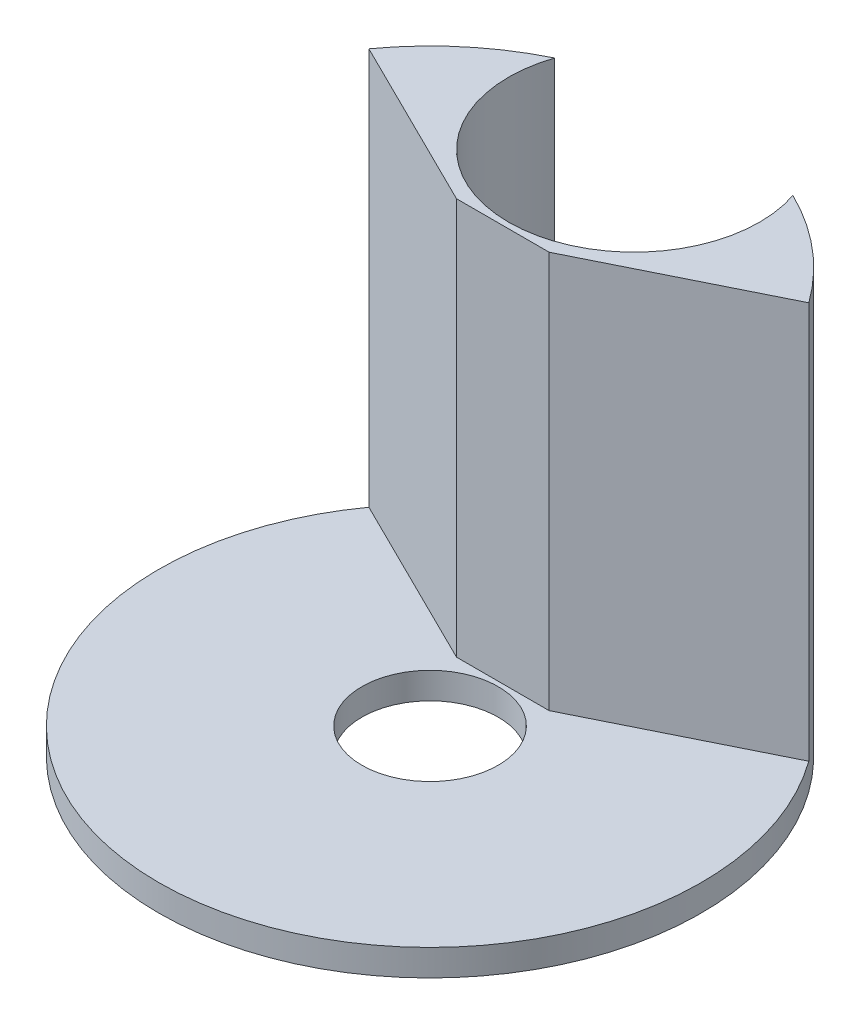
ISO-10303-21;
HEADER;
FILE_DESCRIPTION(('STEP AP214'),'2;1');
FILE_NAME('part.step','',(''),(''),'','','');
FILE_SCHEMA(('AUTOMOTIVE_DESIGN { 1 0 10303 214 1 1 1 1 }'));
ENDSEC;
DATA;
#1=APPLICATION_CONTEXT('core data for automotive mechanical design processes');
#2=APPLICATION_PROTOCOL_DEFINITION('international standard','automotive_design',2000,#1);
#3=PRODUCT_CONTEXT('',#1,'mechanical');
#4=PRODUCT('Part','Part','',(#3));
#5=PRODUCT_RELATED_PRODUCT_CATEGORY('part','',(#4));
#6=PRODUCT_DEFINITION_FORMATION('','',#4);
#7=PRODUCT_DEFINITION_CONTEXT('part definition',#1,'design');
#8=PRODUCT_DEFINITION('design','',#6,#7);
#9=PRODUCT_DEFINITION_SHAPE('','',#8);
#10=(LENGTH_UNIT() NAMED_UNIT(*) SI_UNIT(.MILLI.,.METRE.));
#11=(NAMED_UNIT(*) PLANE_ANGLE_UNIT() SI_UNIT($,.RADIAN.));
#12=(NAMED_UNIT(*) SI_UNIT($,.STERADIAN.) SOLID_ANGLE_UNIT());
#13=UNCERTAINTY_MEASURE_WITH_UNIT(LENGTH_MEASURE(1.E-05),#10,'distance_accuracy_value','');
#14=(GEOMETRIC_REPRESENTATION_CONTEXT(3) GLOBAL_UNCERTAINTY_ASSIGNED_CONTEXT((#13)) GLOBAL_UNIT_ASSIGNED_CONTEXT((#10,
#11,#12)) REPRESENTATION_CONTEXT('',''));
#15=CARTESIAN_POINT('',(0.,0.,0.));
#16=DIRECTION('',(0.,0.,1.));
#17=DIRECTION('',(1.,0.,0.));
#18=AXIS2_PLACEMENT_3D('',#15,#16,#17);
#19=CARTESIAN_POINT('',(0.,2.,0.));
#20=DIRECTION('',(0.,1.,0.));
#21=DIRECTION('',(0.,0.,1.));
#22=AXIS2_PLACEMENT_3D('',#19,#20,#21);
#23=PLANE('',#22);
#24=CARTESIAN_POINT('',(0.,2.,-13.));
#25=DIRECTION('',(0.,1.,0.));
#26=DIRECTION('',(0.,0.,1.));
#27=AXIS2_PLACEMENT_3D('',#24,#25,#26);
#28=CIRCLE('',#27,6.5);
#29=CARTESIAN_POINT('',(0.,2.,-6.5));
#30=VERTEX_POINT('',#29);
#31=EDGE_CURVE('E158',#30,#30,#28,.T.);
#32=ORIENTED_EDGE('',*,*,#31,.F.);
#33=EDGE_LOOP('',(#32));
#34=FACE_BOUND('',#33,.T.);
#35=CARTESIAN_POINT('',(0.,2.,0.));
#36=DIRECTION('',(0.,1.,0.));
#37=DIRECTION('',(0.,0.,1.));
#38=AXIS2_PLACEMENT_3D('',#35,#36,#37);
#39=CIRCLE('',#38,20.5);
#40=CARTESIAN_POINT('',(8.99999999999999,2.,-18.4187404563939));
#41=VERTEX_POINT('',#40);
#42=CARTESIAN_POINT('',(-9.00000000000001,2.,-18.4187404563939));
#43=VERTEX_POINT('',#42);
#44=EDGE_CURVE('E11',#41,#43,#39,.T.);
#45=ORIENTED_EDGE('',*,*,#44,.T.);
#46=CARTESIAN_POINT('',(0.,2.,-15.4184489779728));
#47=DIRECTION('',(0.,1.,0.));
#48=DIRECTION('',(0.,0.,1.));
#49=AXIS2_PLACEMENT_3D('',#46,#47,#48);
#50=CIRCLE('',#49,9.48692515810502);
#51=EDGE_CURVE('E136',#43,#41,#50,.T.);
#52=ORIENTED_EDGE('',*,*,#51,.T.);
#53=EDGE_LOOP('',(#45,#52));
#54=FACE_BOUND('',#53,.T.);
#55=ADVANCED_FACE('F41',(#34,#54),#23,.T.);
#56=CARTESIAN_POINT('',(0.,2.,0.));
#57=DIRECTION('',(0.,-1.,0.));
#58=DIRECTION('',(0.,0.,-1.));
#59=AXIS2_PLACEMENT_3D('',#56,#57,#58);
#60=CYLINDRICAL_SURFACE('',#59,20.5);
#61=ORIENTED_EDGE('',*,*,#44,.F.);
#62=DIRECTION('',(0.,-1.,0.));
#63=VECTOR('',#62,1.);
#64=CARTESIAN_POINT('',(8.99999999999999,32.,-18.4187404563939));
#65=LINE('',#64,#63);
#66=CARTESIAN_POINT('',(8.99999999999999,32.,-18.4187404563939));
#67=VERTEX_POINT('',#66);
#68=EDGE_CURVE('E91',#67,#41,#65,.T.);
#69=ORIENTED_EDGE('',*,*,#68,.F.);
#70=CARTESIAN_POINT('',(0.,32.,0.));
#71=DIRECTION('',(0.,1.,0.));
#72=DIRECTION('',(0.,0.,1.));
#73=AXIS2_PLACEMENT_3D('',#70,#71,#72);
#74=CIRCLE('',#73,20.5);
#75=CARTESIAN_POINT('',(16.6207701385947,32.,-12.));
#76=VERTEX_POINT('',#75);
#77=EDGE_CURVE('E68',#76,#67,#74,.T.);
#78=ORIENTED_EDGE('',*,*,#77,.F.);
#79=DIRECTION('',(0.,-1.,0.));
#80=VECTOR('',#79,1.);
#81=CARTESIAN_POINT('',(16.6207701385947,32.,-12.));
#82=LINE('',#81,#80);
#83=CARTESIAN_POINT('',(16.6207701385947,2.,-12.));
#84=VERTEX_POINT('',#83);
#85=EDGE_CURVE('E125',#76,#84,#82,.T.);
#86=ORIENTED_EDGE('',*,*,#85,.T.);
#87=CARTESIAN_POINT('',(-16.6207701385947,2.,-12.));
#88=VERTEX_POINT('',#87);
#89=EDGE_CURVE('E51',#88,#84,#39,.T.);
#90=ORIENTED_EDGE('',*,*,#89,.F.);
#91=DIRECTION('',(0.,-1.,0.));
#92=VECTOR('',#91,1.);
#93=CARTESIAN_POINT('',(-16.6207701385947,32.,-12.));
#94=LINE('',#93,#92);
#95=CARTESIAN_POINT('',(-16.6207701385947,32.,-12.));
#96=VERTEX_POINT('',#95);
#97=EDGE_CURVE('E59',#96,#88,#94,.T.);
#98=ORIENTED_EDGE('',*,*,#97,.F.);
#99=CARTESIAN_POINT('',(-9.00000000000001,32.,-18.4187404563939));
#100=VERTEX_POINT('',#99);
#101=EDGE_CURVE('E133',#100,#96,#74,.T.);
#102=ORIENTED_EDGE('',*,*,#101,.F.);
#103=DIRECTION('',(0.,-1.,0.));
#104=VECTOR('',#103,1.);
#105=CARTESIAN_POINT('',(-9.00000000000001,32.,-18.4187404563939));
#106=LINE('',#105,#104);
#107=EDGE_CURVE('E96',#100,#43,#106,.T.);
#108=ORIENTED_EDGE('',*,*,#107,.T.);
#109=EDGE_LOOP('',(#61,#69,#78,#86,#90,#98,#102,#108));
#110=FACE_BOUND('',#109,.T.);
#111=CARTESIAN_POINT('',(0.,0.,0.));
#112=DIRECTION('',(0.,1.,0.));
#113=DIRECTION('',(0.,0.,1.));
#114=AXIS2_PLACEMENT_3D('',#111,#112,#113);
#115=CIRCLE('',#114,20.5);
#116=CARTESIAN_POINT('',(0.,0.,20.5));
#117=VERTEX_POINT('',#116);
#118=EDGE_CURVE('E171',#117,#117,#115,.T.);
#119=ORIENTED_EDGE('',*,*,#118,.T.);
#120=EDGE_LOOP('',(#119));
#121=FACE_BOUND('',#120,.T.);
#122=ADVANCED_FACE('F43',(#110,#121),#60,.T.);
#123=DIRECTION('',(0.896070683062667,0.,-0.443911399893724));
#124=VECTOR('',#123,1.);
#125=CARTESIAN_POINT('',(-1.49806729392679,2.,-3.02396871011691));
#126=LINE('',#125,#124);
#127=CARTESIAN_POINT('',(3.5,2.,-5.5));
#128=VERTEX_POINT('',#127);
#129=EDGE_CURVE('E144',#128,#84,#126,.T.);
#130=ORIENTED_EDGE('',*,*,#129,.F.);
#131=DIRECTION('',(1.,0.,0.));
#132=VECTOR('',#131,1.);
#133=CARTESIAN_POINT('',(0.,2.,-5.5));
#134=LINE('',#133,#132);
#135=CARTESIAN_POINT('',(-3.5,2.,-5.5));
#136=VERTEX_POINT('',#135);
#137=EDGE_CURVE('E120',#136,#128,#134,.T.);
#138=ORIENTED_EDGE('',*,*,#137,.F.);
#139=DIRECTION('',(-0.896070683062667,0.,-0.443911399893724));
#140=VECTOR('',#139,1.);
#141=CARTESIAN_POINT('',(1.49806729392679,2.,-3.02396871011691));
#142=LINE('',#141,#140);
#143=EDGE_CURVE('E139',#136,#88,#142,.T.);
#144=ORIENTED_EDGE('',*,*,#143,.T.);
#145=ORIENTED_EDGE('',*,*,#89,.T.);
#146=EDGE_LOOP('',(#130,#138,#144,#145));
#147=FACE_BOUND('',#146,.T.);
#148=CARTESIAN_POINT('',(0.,2.,0.));
#149=DIRECTION('',(0.,1.,0.));
#150=DIRECTION('',(0.,0.,1.));
#151=AXIS2_PLACEMENT_3D('',#148,#149,#150);
#152=CIRCLE('',#151,5.15);
#153=CARTESIAN_POINT('',(0.,2.,5.15));
#154=VERTEX_POINT('',#153);
#155=EDGE_CURVE('E163',#154,#154,#152,.T.);
#156=ORIENTED_EDGE('',*,*,#155,.F.);
#157=EDGE_LOOP('',(#156));
#158=FACE_BOUND('',#157,.T.);
#159=ADVANCED_FACE('F197',(#147,#158),#23,.T.);
#160=CARTESIAN_POINT('',(0.,0.,0.));
#161=DIRECTION('',(0.,1.,0.));
#162=DIRECTION('',(0.,0.,1.));
#163=AXIS2_PLACEMENT_3D('',#160,#161,#162);
#164=PLANE('',#163);
#165=CARTESIAN_POINT('',(0.,0.,-13.));
#166=DIRECTION('',(0.,1.,0.));
#167=DIRECTION('',(0.,0.,1.));
#168=AXIS2_PLACEMENT_3D('',#165,#166,#167);
#169=CIRCLE('',#168,6.5);
#170=CARTESIAN_POINT('',(0.,0.,-6.5));
#171=VERTEX_POINT('',#170);
#172=EDGE_CURVE('E159',#171,#171,#169,.T.);
#173=ORIENTED_EDGE('',*,*,#172,.T.);
#174=EDGE_LOOP('',(#173));
#175=FACE_BOUND('',#174,.T.);
#176=CARTESIAN_POINT('',(0.,0.,0.));
#177=DIRECTION('',(0.,1.,0.));
#178=DIRECTION('',(0.,0.,1.));
#179=AXIS2_PLACEMENT_3D('',#176,#177,#178);
#180=CIRCLE('',#179,5.15);
#181=CARTESIAN_POINT('',(0.,0.,5.15));
#182=VERTEX_POINT('',#181);
#183=EDGE_CURVE('E45',#182,#182,#180,.T.);
#184=ORIENTED_EDGE('',*,*,#183,.T.);
#185=EDGE_LOOP('',(#184));
#186=FACE_BOUND('',#185,.T.);
#187=ORIENTED_EDGE('',*,*,#118,.F.);
#188=EDGE_LOOP('',(#187));
#189=FACE_BOUND('',#188,.T.);
#190=ADVANCED_FACE('F180',(#175,#186,#189),#164,.F.);
#191=CARTESIAN_POINT('',(0.,-1.,0.));
#192=DIRECTION('',(0.,1.,0.));
#193=DIRECTION('',(0.,0.,1.));
#194=AXIS2_PLACEMENT_3D('',#191,#192,#193);
#195=CYLINDRICAL_SURFACE('',#194,5.15);
#196=ORIENTED_EDGE('',*,*,#155,.T.);
#197=EDGE_LOOP('',(#196));
#198=FACE_BOUND('',#197,.T.);
#199=ORIENTED_EDGE('',*,*,#183,.F.);
#200=EDGE_LOOP('',(#199));
#201=FACE_BOUND('',#200,.T.);
#202=ADVANCED_FACE('F183',(#198,#201),#195,.F.);
#203=CARTESIAN_POINT('',(0.,0.,-13.));
#204=DIRECTION('',(0.,1.,0.));
#205=DIRECTION('',(0.,0.,1.));
#206=AXIS2_PLACEMENT_3D('',#203,#204,#205);
#207=CYLINDRICAL_SURFACE('',#206,6.5);
#208=ORIENTED_EDGE('',*,*,#172,.F.);
#209=EDGE_LOOP('',(#208));
#210=FACE_BOUND('',#209,.T.);
#211=ORIENTED_EDGE('',*,*,#31,.T.);
#212=EDGE_LOOP('',(#211));
#213=FACE_BOUND('',#212,.T.);
#214=ADVANCED_FACE('F185',(#210,#213),#207,.F.);
#215=CARTESIAN_POINT('',(0.,32.,-15.4184489779728));
#216=DIRECTION('',(0.,-1.,0.));
#217=DIRECTION('',(0.,0.,-1.));
#218=AXIS2_PLACEMENT_3D('',#215,#216,#217);
#219=CYLINDRICAL_SURFACE('',#218,9.48692515810502);
#220=ORIENTED_EDGE('',*,*,#51,.F.);
#221=ORIENTED_EDGE('',*,*,#107,.F.);
#222=CARTESIAN_POINT('',(0.,32.,-15.4184489779728));
#223=DIRECTION('',(0.,1.,0.));
#224=DIRECTION('',(0.,0.,1.));
#225=AXIS2_PLACEMENT_3D('',#222,#223,#224);
#226=CIRCLE('',#225,9.48692515810502);
#227=EDGE_CURVE('E147',#100,#67,#226,.T.);
#228=ORIENTED_EDGE('',*,*,#227,.T.);
#229=ORIENTED_EDGE('',*,*,#68,.T.);
#230=EDGE_LOOP('',(#220,#221,#228,#229));
#231=FACE_BOUND('',#230,.T.);
#232=ADVANCED_FACE('F193',(#231),#219,.F.);
#233=CARTESIAN_POINT('',(1.49806729392679,32.,-3.02396871011691));
#234=DIRECTION('',(-0.443911399893724,0.,0.896070683062667));
#235=DIRECTION('',(0.896070683062667,0.,0.443911399893724));
#236=AXIS2_PLACEMENT_3D('',#233,#234,#235);
#237=PLANE('',#236);
#238=ORIENTED_EDGE('',*,*,#143,.F.);
#239=DIRECTION('',(0.,-1.,0.));
#240=VECTOR('',#239,1.);
#241=CARTESIAN_POINT('',(-3.5,32.,-5.5));
#242=LINE('',#241,#240);
#243=CARTESIAN_POINT('',(-3.5,32.,-5.5));
#244=VERTEX_POINT('',#243);
#245=EDGE_CURVE('E124',#244,#136,#242,.T.);
#246=ORIENTED_EDGE('',*,*,#245,.F.);
#247=DIRECTION('',(-0.896070683062667,0.,-0.443911399893724));
#248=VECTOR('',#247,1.);
#249=CARTESIAN_POINT('',(1.49806729392679,32.,-3.02396871011691));
#250=LINE('',#249,#248);
#251=EDGE_CURVE('E112',#244,#96,#250,.T.);
#252=ORIENTED_EDGE('',*,*,#251,.T.);
#253=ORIENTED_EDGE('',*,*,#97,.T.);
#254=EDGE_LOOP('',(#238,#246,#252,#253));
#255=FACE_BOUND('',#254,.T.);
#256=ADVANCED_FACE('F222',(#255),#237,.T.);
#257=CARTESIAN_POINT('',(0.,32.,-5.5));
#258=DIRECTION('',(0.,0.,-1.));
#259=DIRECTION('',(-1.,0.,0.));
#260=AXIS2_PLACEMENT_3D('',#257,#258,#259);
#261=PLANE('',#260);
#262=ORIENTED_EDGE('',*,*,#137,.T.);
#263=DIRECTION('',(0.,-1.,0.));
#264=VECTOR('',#263,1.);
#265=CARTESIAN_POINT('',(3.5,32.,-5.5));
#266=LINE('',#265,#264);
#267=CARTESIAN_POINT('',(3.5,32.,-5.5));
#268=VERTEX_POINT('',#267);
#269=EDGE_CURVE('E117',#268,#128,#266,.T.);
#270=ORIENTED_EDGE('',*,*,#269,.F.);
#271=DIRECTION('',(1.,0.,0.));
#272=VECTOR('',#271,1.);
#273=CARTESIAN_POINT('',(0.,32.,-5.5));
#274=LINE('',#273,#272);
#275=EDGE_CURVE('E106',#244,#268,#274,.T.);
#276=ORIENTED_EDGE('',*,*,#275,.F.);
#277=ORIENTED_EDGE('',*,*,#245,.T.);
#278=EDGE_LOOP('',(#262,#270,#276,#277));
#279=FACE_BOUND('',#278,.T.);
#280=ADVANCED_FACE('F118',(#279),#261,.F.);
#281=CARTESIAN_POINT('',(-1.49806729392679,32.,-3.02396871011691));
#282=DIRECTION('',(-0.443911399893724,0.,-0.896070683062667));
#283=DIRECTION('',(-0.896070683062667,0.,0.443911399893724));
#284=AXIS2_PLACEMENT_3D('',#281,#282,#283);
#285=PLANE('',#284);
#286=ORIENTED_EDGE('',*,*,#129,.T.);
#287=ORIENTED_EDGE('',*,*,#85,.F.);
#288=DIRECTION('',(0.896070683062667,0.,-0.443911399893724));
#289=VECTOR('',#288,1.);
#290=CARTESIAN_POINT('',(-1.49806729392679,32.,-3.02396871011691));
#291=LINE('',#290,#289);
#292=EDGE_CURVE('E110',#268,#76,#291,.T.);
#293=ORIENTED_EDGE('',*,*,#292,.F.);
#294=ORIENTED_EDGE('',*,*,#269,.T.);
#295=EDGE_LOOP('',(#286,#287,#293,#294));
#296=FACE_BOUND('',#295,.T.);
#297=ADVANCED_FACE('F127',(#296),#285,.F.);
#298=CARTESIAN_POINT('',(0.,32.,0.));
#299=DIRECTION('',(0.,1.,0.));
#300=DIRECTION('',(0.,0.,1.));
#301=AXIS2_PLACEMENT_3D('',#298,#299,#300);
#302=PLANE('',#301);
#303=ORIENTED_EDGE('',*,*,#227,.F.);
#304=ORIENTED_EDGE('',*,*,#101,.T.);
#305=ORIENTED_EDGE('',*,*,#251,.F.);
#306=ORIENTED_EDGE('',*,*,#275,.T.);
#307=ORIENTED_EDGE('',*,*,#292,.T.);
#308=ORIENTED_EDGE('',*,*,#77,.T.);
#309=EDGE_LOOP('',(#303,#304,#305,#306,#307,#308));
#310=FACE_BOUND('',#309,.T.);
#311=ADVANCED_FACE('F108',(#310),#302,.T.);
#312=CLOSED_SHELL('',(#55,#122,#159,#190,#202,#214,#232,#256,#280,#297,#311));
#313=MANIFOLD_SOLID_BREP('B2',#312);
#314=ADVANCED_BREP_SHAPE_REPRESENTATION('',(#18,#313),#14);
#315=SHAPE_DEFINITION_REPRESENTATION(#9,#314);
ENDSEC;
END-ISO-10303-21;
